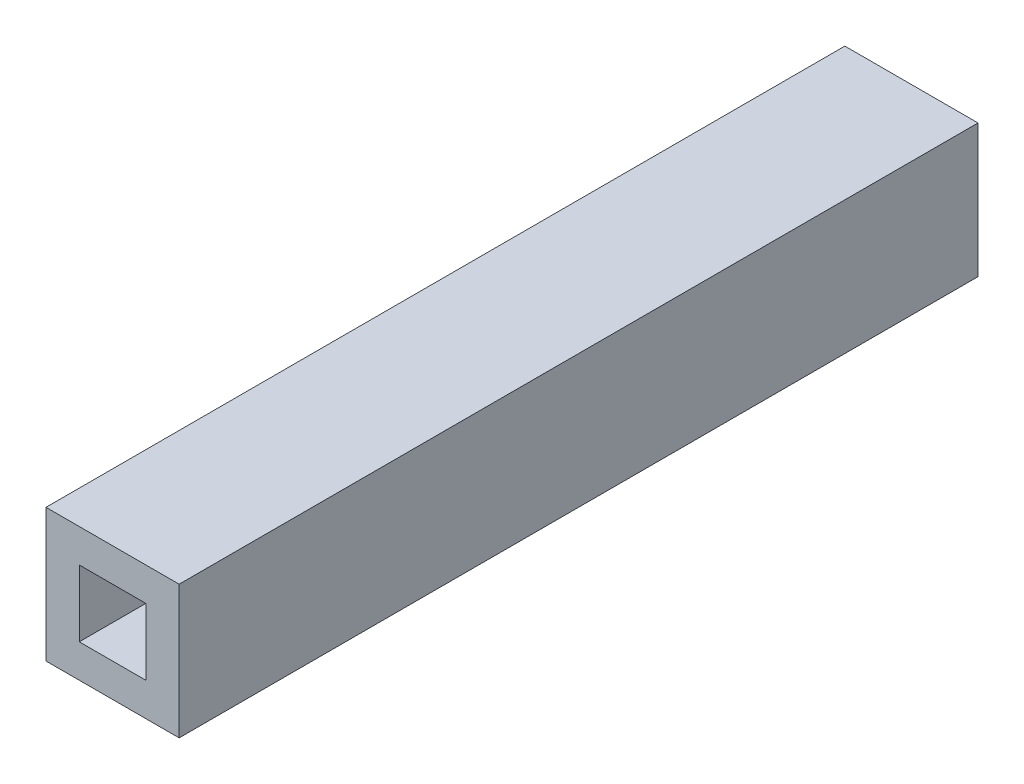
ISO-10303-21;
HEADER;
FILE_DESCRIPTION(('STEP AP214'),'2;1');
FILE_NAME('part.step','',(''),(''),'','','');
FILE_SCHEMA(('AUTOMOTIVE_DESIGN { 1 0 10303 214 1 1 1 1 }'));
ENDSEC;
DATA;
#1=APPLICATION_CONTEXT('core data for automotive mechanical design processes');
#2=APPLICATION_PROTOCOL_DEFINITION('international standard','automotive_design',2000,#1);
#3=PRODUCT_CONTEXT('',#1,'mechanical');
#4=PRODUCT('Part','Part','',(#3));
#5=PRODUCT_RELATED_PRODUCT_CATEGORY('part','',(#4));
#6=PRODUCT_DEFINITION_FORMATION('','',#4);
#7=PRODUCT_DEFINITION_CONTEXT('part definition',#1,'design');
#8=PRODUCT_DEFINITION('design','',#6,#7);
#9=PRODUCT_DEFINITION_SHAPE('','',#8);
#10=(LENGTH_UNIT() NAMED_UNIT(*) SI_UNIT(.MILLI.,.METRE.));
#11=(NAMED_UNIT(*) PLANE_ANGLE_UNIT() SI_UNIT($,.RADIAN.));
#12=(NAMED_UNIT(*) SI_UNIT($,.STERADIAN.) SOLID_ANGLE_UNIT());
#13=UNCERTAINTY_MEASURE_WITH_UNIT(LENGTH_MEASURE(1.E-05),#10,'distance_accuracy_value','');
#14=(GEOMETRIC_REPRESENTATION_CONTEXT(3) GLOBAL_UNCERTAINTY_ASSIGNED_CONTEXT((#13)) GLOBAL_UNIT_ASSIGNED_CONTEXT((#10,
#11,#12)) REPRESENTATION_CONTEXT('',''));
#15=CARTESIAN_POINT('',(0.,0.,0.));
#16=DIRECTION('',(0.,0.,1.));
#17=DIRECTION('',(1.,0.,0.));
#18=AXIS2_PLACEMENT_3D('',#15,#16,#17);
#19=CARTESIAN_POINT('',(0.,0.,152.4));
#20=DIRECTION('',(0.,0.,1.));
#21=DIRECTION('',(1.,0.,0.));
#22=AXIS2_PLACEMENT_3D('',#19,#20,#21);
#23=PLANE('',#22);
#24=DIRECTION('',(0.,1.,0.));
#25=VECTOR('',#24,1.);
#26=CARTESIAN_POINT('',(0.,0.,152.4));
#27=LINE('',#26,#25);
#28=CARTESIAN_POINT('',(0.,0.,152.4));
#29=VERTEX_POINT('',#28);
#30=CARTESIAN_POINT('',(0.,25.4,152.4));
#31=VERTEX_POINT('',#30);
#32=EDGE_CURVE('E153',#29,#31,#27,.T.);
#33=ORIENTED_EDGE('',*,*,#32,.T.);
#34=DIRECTION('',(-1.,0.,0.));
#35=VECTOR('',#34,1.);
#36=CARTESIAN_POINT('',(0.,25.4,152.4));
#37=LINE('',#36,#35);
#38=CARTESIAN_POINT('',(-25.4,25.4,152.4));
#39=VERTEX_POINT('',#38);
#40=EDGE_CURVE('E157',#31,#39,#37,.T.);
#41=ORIENTED_EDGE('',*,*,#40,.T.);
#42=DIRECTION('',(0.,-1.,0.));
#43=VECTOR('',#42,1.);
#44=CARTESIAN_POINT('',(-25.4,0.,152.4));
#45=LINE('',#44,#43);
#46=CARTESIAN_POINT('',(-25.4,0.,152.4));
#47=VERTEX_POINT('',#46);
#48=EDGE_CURVE('E161',#39,#47,#45,.T.);
#49=ORIENTED_EDGE('',*,*,#48,.T.);
#50=DIRECTION('',(1.,0.,0.));
#51=VECTOR('',#50,1.);
#52=CARTESIAN_POINT('',(0.,0.,152.4));
#53=LINE('',#52,#51);
#54=EDGE_CURVE('E164',#47,#29,#53,.T.);
#55=ORIENTED_EDGE('',*,*,#54,.T.);
#56=EDGE_LOOP('',(#33,#41,#49,#55));
#57=FACE_BOUND('',#56,.T.);
#58=DIRECTION('',(1.,0.,0.));
#59=VECTOR('',#58,1.);
#60=CARTESIAN_POINT('',(-19.05,6.35,152.4));
#61=LINE('',#60,#59);
#62=CARTESIAN_POINT('',(-19.05,6.35,152.4));
#63=VERTEX_POINT('',#62);
#64=CARTESIAN_POINT('',(-6.35,6.35,152.4));
#65=VERTEX_POINT('',#64);
#66=EDGE_CURVE('E114',#63,#65,#61,.T.);
#67=ORIENTED_EDGE('',*,*,#66,.F.);
#68=DIRECTION('',(0.,-1.,0.));
#69=VECTOR('',#68,1.);
#70=CARTESIAN_POINT('',(-19.05,19.05,152.4));
#71=LINE('',#70,#69);
#72=CARTESIAN_POINT('',(-19.05,19.05,152.4));
#73=VERTEX_POINT('',#72);
#74=EDGE_CURVE('E105',#73,#63,#71,.T.);
#75=ORIENTED_EDGE('',*,*,#74,.F.);
#76=DIRECTION('',(-1.,0.,0.));
#77=VECTOR('',#76,1.);
#78=CARTESIAN_POINT('',(-19.05,19.05,152.4));
#79=LINE('',#78,#77);
#80=CARTESIAN_POINT('',(-6.35,19.05,152.4));
#81=VERTEX_POINT('',#80);
#82=EDGE_CURVE('E131',#81,#73,#79,.T.);
#83=ORIENTED_EDGE('',*,*,#82,.F.);
#84=DIRECTION('',(0.,1.,0.));
#85=VECTOR('',#84,1.);
#86=CARTESIAN_POINT('',(-6.35,19.05,152.4));
#87=LINE('',#86,#85);
#88=EDGE_CURVE('E127',#65,#81,#87,.T.);
#89=ORIENTED_EDGE('',*,*,#88,.F.);
#90=EDGE_LOOP('',(#67,#75,#83,#89));
#91=FACE_BOUND('',#90,.T.);
#92=ADVANCED_FACE('F39',(#57,#91),#23,.T.);
#93=CARTESIAN_POINT('',(0.,0.,0.));
#94=DIRECTION('',(0.,0.,1.));
#95=DIRECTION('',(1.,0.,0.));
#96=AXIS2_PLACEMENT_3D('',#93,#94,#95);
#97=PLANE('',#96);
#98=DIRECTION('',(0.,1.,0.));
#99=VECTOR('',#98,1.);
#100=CARTESIAN_POINT('',(0.,0.,0.));
#101=LINE('',#100,#99);
#102=CARTESIAN_POINT('',(0.,0.,0.));
#103=VERTEX_POINT('',#102);
#104=CARTESIAN_POINT('',(0.,25.4,0.));
#105=VERTEX_POINT('',#104);
#106=EDGE_CURVE('E123',#103,#105,#101,.T.);
#107=ORIENTED_EDGE('',*,*,#106,.F.);
#108=DIRECTION('',(1.,0.,0.));
#109=VECTOR('',#108,1.);
#110=CARTESIAN_POINT('',(0.,0.,0.));
#111=LINE('',#110,#109);
#112=CARTESIAN_POINT('',(-25.4,0.,0.));
#113=VERTEX_POINT('',#112);
#114=EDGE_CURVE('E158',#113,#103,#111,.T.);
#115=ORIENTED_EDGE('',*,*,#114,.F.);
#116=DIRECTION('',(0.,-1.,0.));
#117=VECTOR('',#116,1.);
#118=CARTESIAN_POINT('',(-25.4,0.,0.));
#119=LINE('',#118,#117);
#120=CARTESIAN_POINT('',(-25.4,25.4,0.));
#121=VERTEX_POINT('',#120);
#122=EDGE_CURVE('E174',#121,#113,#119,.T.);
#123=ORIENTED_EDGE('',*,*,#122,.F.);
#124=DIRECTION('',(-1.,0.,0.));
#125=VECTOR('',#124,1.);
#126=CARTESIAN_POINT('',(0.,25.4,0.));
#127=LINE('',#126,#125);
#128=EDGE_CURVE('E171',#105,#121,#127,.T.);
#129=ORIENTED_EDGE('',*,*,#128,.F.);
#130=EDGE_LOOP('',(#107,#115,#123,#129));
#131=FACE_BOUND('',#130,.T.);
#132=DIRECTION('',(0.,-1.,0.));
#133=VECTOR('',#132,1.);
#134=CARTESIAN_POINT('',(-19.05,19.05,0.));
#135=LINE('',#134,#133);
#136=CARTESIAN_POINT('',(-19.05,19.05,0.));
#137=VERTEX_POINT('',#136);
#138=CARTESIAN_POINT('',(-19.05,6.35,0.));
#139=VERTEX_POINT('',#138);
#140=EDGE_CURVE('E63',#137,#139,#135,.T.);
#141=ORIENTED_EDGE('',*,*,#140,.T.);
#142=DIRECTION('',(1.,0.,0.));
#143=VECTOR('',#142,1.);
#144=CARTESIAN_POINT('',(-19.05,6.35,0.));
#145=LINE('',#144,#143);
#146=CARTESIAN_POINT('',(-6.35,6.35,0.));
#147=VERTEX_POINT('',#146);
#148=EDGE_CURVE('E121',#139,#147,#145,.T.);
#149=ORIENTED_EDGE('',*,*,#148,.T.);
#150=DIRECTION('',(0.,1.,0.));
#151=VECTOR('',#150,1.);
#152=CARTESIAN_POINT('',(-6.35,19.05,0.));
#153=LINE('',#152,#151);
#154=CARTESIAN_POINT('',(-6.35,19.05,0.));
#155=VERTEX_POINT('',#154);
#156=EDGE_CURVE('E140',#147,#155,#153,.T.);
#157=ORIENTED_EDGE('',*,*,#156,.T.);
#158=DIRECTION('',(-1.,0.,0.));
#159=VECTOR('',#158,1.);
#160=CARTESIAN_POINT('',(-19.05,19.05,0.));
#161=LINE('',#160,#159);
#162=EDGE_CURVE('E115',#155,#137,#161,.T.);
#163=ORIENTED_EDGE('',*,*,#162,.T.);
#164=EDGE_LOOP('',(#141,#149,#157,#163));
#165=FACE_BOUND('',#164,.T.);
#166=ADVANCED_FACE('F197',(#131,#165),#97,.F.);
#167=CARTESIAN_POINT('',(0.,0.,152.4));
#168=DIRECTION('',(-1.,0.,0.));
#169=DIRECTION('',(0.,-1.,0.));
#170=AXIS2_PLACEMENT_3D('',#167,#168,#169);
#171=PLANE('',#170);
#172=ORIENTED_EDGE('',*,*,#106,.T.);
#173=DIRECTION('',(0.,0.,-1.));
#174=VECTOR('',#173,1.);
#175=CARTESIAN_POINT('',(0.,25.4,152.4));
#176=LINE('',#175,#174);
#177=EDGE_CURVE('E11',#31,#105,#176,.T.);
#178=ORIENTED_EDGE('',*,*,#177,.F.);
#179=ORIENTED_EDGE('',*,*,#32,.F.);
#180=DIRECTION('',(0.,0.,-1.));
#181=VECTOR('',#180,1.);
#182=CARTESIAN_POINT('',(0.,0.,152.4));
#183=LINE('',#182,#181);
#184=EDGE_CURVE('E167',#29,#103,#183,.T.);
#185=ORIENTED_EDGE('',*,*,#184,.T.);
#186=EDGE_LOOP('',(#172,#178,#179,#185));
#187=FACE_BOUND('',#186,.T.);
#188=ADVANCED_FACE('F41',(#187),#171,.F.);
#189=CARTESIAN_POINT('',(0.,25.4,152.4));
#190=DIRECTION('',(0.,-1.,0.));
#191=DIRECTION('',(1.,0.,0.));
#192=AXIS2_PLACEMENT_3D('',#189,#190,#191);
#193=PLANE('',#192);
#194=ORIENTED_EDGE('',*,*,#128,.T.);
#195=DIRECTION('',(0.,0.,-1.));
#196=VECTOR('',#195,1.);
#197=CARTESIAN_POINT('',(-25.4,25.4,152.4));
#198=LINE('',#197,#196);
#199=EDGE_CURVE('E48',#39,#121,#198,.T.);
#200=ORIENTED_EDGE('',*,*,#199,.F.);
#201=ORIENTED_EDGE('',*,*,#40,.F.);
#202=ORIENTED_EDGE('',*,*,#177,.T.);
#203=EDGE_LOOP('',(#194,#200,#201,#202));
#204=FACE_BOUND('',#203,.T.);
#205=ADVANCED_FACE('F207',(#204),#193,.F.);
#206=CARTESIAN_POINT('',(-25.4,0.,152.4));
#207=DIRECTION('',(1.,0.,0.));
#208=DIRECTION('',(0.,0.,-1.));
#209=AXIS2_PLACEMENT_3D('',#206,#207,#208);
#210=PLANE('',#209);
#211=ORIENTED_EDGE('',*,*,#122,.T.);
#212=DIRECTION('',(0.,0.,-1.));
#213=VECTOR('',#212,1.);
#214=CARTESIAN_POINT('',(-25.4,0.,152.4));
#215=LINE('',#214,#213);
#216=EDGE_CURVE('E182',#47,#113,#215,.T.);
#217=ORIENTED_EDGE('',*,*,#216,.F.);
#218=ORIENTED_EDGE('',*,*,#48,.F.);
#219=ORIENTED_EDGE('',*,*,#199,.T.);
#220=EDGE_LOOP('',(#211,#217,#218,#219));
#221=FACE_BOUND('',#220,.T.);
#222=ADVANCED_FACE('F191',(#221),#210,.F.);
#223=CARTESIAN_POINT('',(0.,0.,152.4));
#224=DIRECTION('',(0.,1.,0.));
#225=DIRECTION('',(0.,0.,1.));
#226=AXIS2_PLACEMENT_3D('',#223,#224,#225);
#227=PLANE('',#226);
#228=ORIENTED_EDGE('',*,*,#114,.T.);
#229=ORIENTED_EDGE('',*,*,#184,.F.);
#230=ORIENTED_EDGE('',*,*,#54,.F.);
#231=ORIENTED_EDGE('',*,*,#216,.T.);
#232=EDGE_LOOP('',(#228,#229,#230,#231));
#233=FACE_BOUND('',#232,.T.);
#234=ADVANCED_FACE('F201',(#233),#227,.F.);
#235=CARTESIAN_POINT('',(-19.05,19.05,152.4));
#236=DIRECTION('',(1.,0.,0.));
#237=DIRECTION('',(0.,0.,-1.));
#238=AXIS2_PLACEMENT_3D('',#235,#236,#237);
#239=PLANE('',#238);
#240=ORIENTED_EDGE('',*,*,#140,.F.);
#241=DIRECTION('',(0.,0.,-1.));
#242=VECTOR('',#241,1.);
#243=CARTESIAN_POINT('',(-19.05,19.05,152.4));
#244=LINE('',#243,#242);
#245=EDGE_CURVE('E109',#73,#137,#244,.T.);
#246=ORIENTED_EDGE('',*,*,#245,.F.);
#247=ORIENTED_EDGE('',*,*,#74,.T.);
#248=DIRECTION('',(0.,0.,-1.));
#249=VECTOR('',#248,1.);
#250=CARTESIAN_POINT('',(-19.05,6.35,152.4));
#251=LINE('',#250,#249);
#252=EDGE_CURVE('E108',#63,#139,#251,.T.);
#253=ORIENTED_EDGE('',*,*,#252,.T.);
#254=EDGE_LOOP('',(#240,#246,#247,#253));
#255=FACE_BOUND('',#254,.T.);
#256=ADVANCED_FACE('F107',(#255),#239,.T.);
#257=CARTESIAN_POINT('',(-19.05,6.35,152.4));
#258=DIRECTION('',(0.,1.,0.));
#259=DIRECTION('',(-1.,0.,0.));
#260=AXIS2_PLACEMENT_3D('',#257,#258,#259);
#261=PLANE('',#260);
#262=ORIENTED_EDGE('',*,*,#148,.F.);
#263=ORIENTED_EDGE('',*,*,#252,.F.);
#264=ORIENTED_EDGE('',*,*,#66,.T.);
#265=DIRECTION('',(0.,0.,-1.));
#266=VECTOR('',#265,1.);
#267=CARTESIAN_POINT('',(-6.35,6.35,152.4));
#268=LINE('',#267,#266);
#269=EDGE_CURVE('E124',#65,#147,#268,.T.);
#270=ORIENTED_EDGE('',*,*,#269,.T.);
#271=EDGE_LOOP('',(#262,#263,#264,#270));
#272=FACE_BOUND('',#271,.T.);
#273=ADVANCED_FACE('F118',(#272),#261,.T.);
#274=CARTESIAN_POINT('',(-6.35,19.05,152.4));
#275=DIRECTION('',(-1.,0.,0.));
#276=DIRECTION('',(0.,0.,1.));
#277=AXIS2_PLACEMENT_3D('',#274,#275,#276);
#278=PLANE('',#277);
#279=ORIENTED_EDGE('',*,*,#156,.F.);
#280=ORIENTED_EDGE('',*,*,#269,.F.);
#281=ORIENTED_EDGE('',*,*,#88,.T.);
#282=DIRECTION('',(0.,0.,-1.));
#283=VECTOR('',#282,1.);
#284=CARTESIAN_POINT('',(-6.35,19.05,152.4));
#285=LINE('',#284,#283);
#286=EDGE_CURVE('E55',#81,#155,#285,.T.);
#287=ORIENTED_EDGE('',*,*,#286,.T.);
#288=EDGE_LOOP('',(#279,#280,#281,#287));
#289=FACE_BOUND('',#288,.T.);
#290=ADVANCED_FACE('F230',(#289),#278,.T.);
#291=CARTESIAN_POINT('',(-19.05,19.05,152.4));
#292=DIRECTION('',(0.,-1.,0.));
#293=DIRECTION('',(1.,0.,0.));
#294=AXIS2_PLACEMENT_3D('',#291,#292,#293);
#295=PLANE('',#294);
#296=ORIENTED_EDGE('',*,*,#162,.F.);
#297=ORIENTED_EDGE('',*,*,#286,.F.);
#298=ORIENTED_EDGE('',*,*,#82,.T.);
#299=ORIENTED_EDGE('',*,*,#245,.T.);
#300=EDGE_LOOP('',(#296,#297,#298,#299));
#301=FACE_BOUND('',#300,.T.);
#302=ADVANCED_FACE('F234',(#301),#295,.T.);
#303=CLOSED_SHELL('',(#92,#166,#188,#205,#222,#234,#256,#273,#290,#302));
#304=MANIFOLD_SOLID_BREP('B2',#303);
#305=ADVANCED_BREP_SHAPE_REPRESENTATION('',(#18,#304),#14);
#306=SHAPE_DEFINITION_REPRESENTATION(#9,#305);
ENDSEC;
END-ISO-10303-21;
